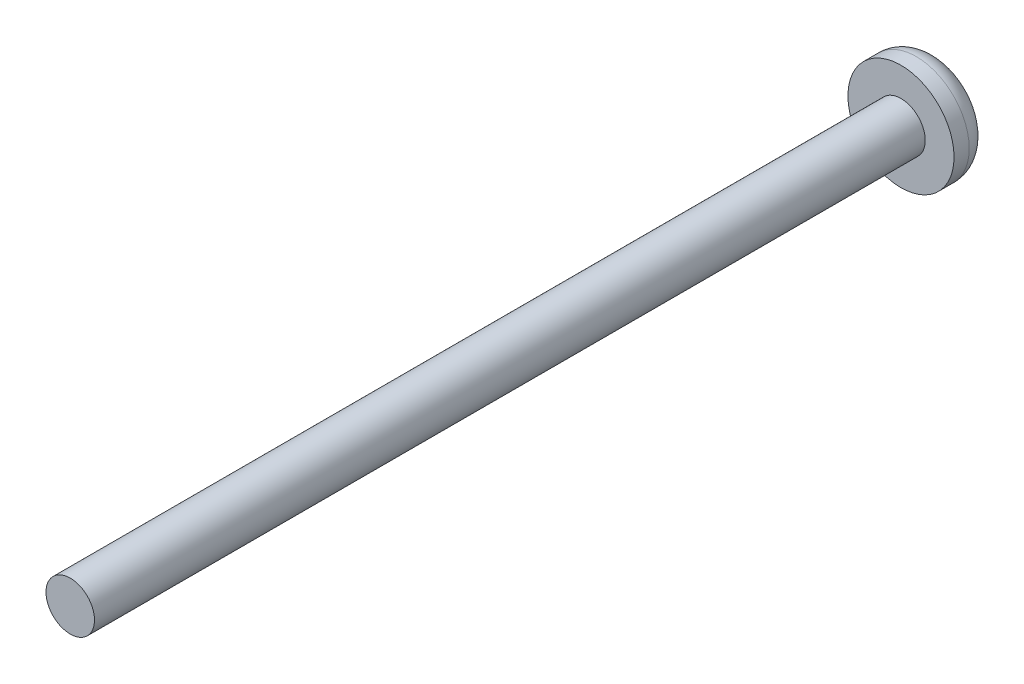
ISO-10303-21;
HEADER;
FILE_DESCRIPTION(('STEP AP214'),'2;1');
FILE_NAME('part.step','',(''),(''),'','','');
FILE_SCHEMA(('AUTOMOTIVE_DESIGN { 1 0 10303 214 1 1 1 1 }'));
ENDSEC;
DATA;
#1=APPLICATION_CONTEXT('core data for automotive mechanical design processes');
#2=APPLICATION_PROTOCOL_DEFINITION('international standard','automotive_design',2000,#1);
#3=PRODUCT_CONTEXT('',#1,'mechanical');
#4=PRODUCT('Part','Part','',(#3));
#5=PRODUCT_RELATED_PRODUCT_CATEGORY('part','',(#4));
#6=PRODUCT_DEFINITION_FORMATION('','',#4);
#7=PRODUCT_DEFINITION_CONTEXT('part definition',#1,'design');
#8=PRODUCT_DEFINITION('design','',#6,#7);
#9=PRODUCT_DEFINITION_SHAPE('','',#8);
#10=(LENGTH_UNIT() NAMED_UNIT(*) SI_UNIT(.MILLI.,.METRE.));
#11=(NAMED_UNIT(*) PLANE_ANGLE_UNIT() SI_UNIT($,.RADIAN.));
#12=(NAMED_UNIT(*) SI_UNIT($,.STERADIAN.) SOLID_ANGLE_UNIT());
#13=UNCERTAINTY_MEASURE_WITH_UNIT(LENGTH_MEASURE(1.E-05),#10,'distance_accuracy_value','');
#14=(GEOMETRIC_REPRESENTATION_CONTEXT(3) GLOBAL_UNCERTAINTY_ASSIGNED_CONTEXT((#13)) GLOBAL_UNIT_ASSIGNED_CONTEXT((#10,
#11,#12)) REPRESENTATION_CONTEXT('',''));
#15=CARTESIAN_POINT('',(0.,0.,0.));
#16=DIRECTION('',(0.,0.,1.));
#17=DIRECTION('',(1.,0.,0.));
#18=AXIS2_PLACEMENT_3D('',#15,#16,#17);
#19=CARTESIAN_POINT('',(0.,0.,0.));
#20=DIRECTION('',(0.,0.,1.));
#21=DIRECTION('',(1.,0.,0.));
#22=AXIS2_PLACEMENT_3D('',#19,#20,#21);
#23=PLANE('',#22);
#24=DIRECTION('',(0.,1.,0.));
#25=VECTOR('',#24,1.);
#26=CARTESIAN_POINT('',(-0.115,1.2,0.));
#27=LINE('',#26,#25);
#28=CARTESIAN_POINT('',(-0.115,-1.04368338110751,0.));
#29=VERTEX_POINT('',#28);
#30=CARTESIAN_POINT('',(-0.115000000000001,-0.115,0.));
#31=VERTEX_POINT('',#30);
#32=EDGE_CURVE('E150',#29,#31,#27,.T.);
#33=ORIENTED_EDGE('',*,*,#32,.F.);
#34=CARTESIAN_POINT('',(0.,0.,0.));
#35=DIRECTION('',(0.,0.,1.));
#36=DIRECTION('',(1.,0.,0.));
#37=AXIS2_PLACEMENT_3D('',#34,#35,#36);
#38=CIRCLE('',#37,1.05);
#39=CARTESIAN_POINT('',(-1.04368338110751,-0.114999999999996,0.));
#40=VERTEX_POINT('',#39);
#41=EDGE_CURVE('E283',#29,#40,#38,.F.);
#42=ORIENTED_EDGE('',*,*,#41,.T.);
#43=DIRECTION('',(-1.,0.,0.));
#44=VECTOR('',#43,1.);
#45=CARTESIAN_POINT('',(1.2,-0.115000000000004,0.));
#46=LINE('',#45,#44);
#47=EDGE_CURVE('E172',#31,#40,#46,.T.);
#48=ORIENTED_EDGE('',*,*,#47,.F.);
#49=EDGE_LOOP('',(#33,#42,#48));
#50=FACE_BOUND('',#49,.T.);
#51=ADVANCED_FACE('F37',(#50),#23,.F.);
#52=DIRECTION('',(1.,0.,0.));
#53=VECTOR('',#52,1.);
#54=CARTESIAN_POINT('',(1.2,0.114999999999996,0.));
#55=LINE('',#54,#53);
#56=CARTESIAN_POINT('',(-1.04368338110751,0.115000000000004,0.));
#57=VERTEX_POINT('',#56);
#58=CARTESIAN_POINT('',(-0.114999999999999,0.115000000000001,0.));
#59=VERTEX_POINT('',#58);
#60=EDGE_CURVE('E122',#57,#59,#55,.T.);
#61=ORIENTED_EDGE('',*,*,#60,.F.);
#62=CARTESIAN_POINT('',(0.,0.,0.));
#63=DIRECTION('',(0.,0.,1.));
#64=DIRECTION('',(1.,0.,0.));
#65=AXIS2_PLACEMENT_3D('',#62,#63,#64);
#66=CIRCLE('',#65,1.05);
#67=CARTESIAN_POINT('',(-0.115,1.04368338110751,0.));
#68=VERTEX_POINT('',#67);
#69=EDGE_CURVE('E149',#57,#68,#66,.F.);
#70=ORIENTED_EDGE('',*,*,#69,.T.);
#71=EDGE_CURVE('E140',#59,#68,#27,.T.);
#72=ORIENTED_EDGE('',*,*,#71,.F.);
#73=EDGE_LOOP('',(#61,#70,#72));
#74=FACE_BOUND('',#73,.T.);
#75=ADVANCED_FACE('F148',(#74),#23,.F.);
#76=DIRECTION('',(0.,-1.,0.));
#77=VECTOR('',#76,1.);
#78=CARTESIAN_POINT('',(0.115,1.2,0.));
#79=LINE('',#78,#77);
#80=CARTESIAN_POINT('',(0.115,1.04368338110751,0.));
#81=VERTEX_POINT('',#80);
#82=CARTESIAN_POINT('',(0.115000000000001,0.114999999999999,0.));
#83=VERTEX_POINT('',#82);
#84=EDGE_CURVE('E267',#81,#83,#79,.T.);
#85=ORIENTED_EDGE('',*,*,#84,.F.);
#86=CARTESIAN_POINT('',(0.,0.,0.));
#87=DIRECTION('',(0.,0.,1.));
#88=DIRECTION('',(1.,0.,0.));
#89=AXIS2_PLACEMENT_3D('',#86,#87,#88);
#90=CIRCLE('',#89,1.05);
#91=CARTESIAN_POINT('',(1.04368338110751,0.114999999999996,0.));
#92=VERTEX_POINT('',#91);
#93=EDGE_CURVE('E274',#81,#92,#90,.F.);
#94=ORIENTED_EDGE('',*,*,#93,.T.);
#95=EDGE_CURVE('E134',#83,#92,#55,.T.);
#96=ORIENTED_EDGE('',*,*,#95,.F.);
#97=EDGE_LOOP('',(#85,#94,#96));
#98=FACE_BOUND('',#97,.T.);
#99=ADVANCED_FACE('F357',(#98),#23,.F.);
#100=CARTESIAN_POINT('',(1.04368338110751,-0.115000000000004,0.));
#101=VERTEX_POINT('',#100);
#102=CARTESIAN_POINT('',(0.115,-0.115000000000001,0.));
#103=VERTEX_POINT('',#102);
#104=EDGE_CURVE('E168',#101,#103,#46,.T.);
#105=ORIENTED_EDGE('',*,*,#104,.F.);
#106=CARTESIAN_POINT('',(0.,0.,0.));
#107=DIRECTION('',(0.,0.,1.));
#108=DIRECTION('',(1.,0.,0.));
#109=AXIS2_PLACEMENT_3D('',#106,#107,#108);
#110=CIRCLE('',#109,1.05);
#111=CARTESIAN_POINT('',(0.115,-1.04368338110751,0.));
#112=VERTEX_POINT('',#111);
#113=EDGE_CURVE('E173',#101,#112,#110,.F.);
#114=ORIENTED_EDGE('',*,*,#113,.T.);
#115=EDGE_CURVE('E152',#103,#112,#79,.T.);
#116=ORIENTED_EDGE('',*,*,#115,.F.);
#117=EDGE_LOOP('',(#105,#114,#116));
#118=FACE_BOUND('',#117,.T.);
#119=ADVANCED_FACE('F211',(#118),#23,.F.);
#120=CARTESIAN_POINT('',(0.,0.,0.85));
#121=DIRECTION('',(0.99097150999577,0.,-0.134072616058251));
#122=DIRECTION('',(-0.134072616058251,0.,-0.99097150999577));
#123=AXIS2_PLACEMENT_3D('',#120,#121,#122);
#124=PLANE('',#123);
#125=ORIENTED_EDGE('',*,*,#71,.T.);
#126=CARTESIAN_POINT('',(-0.115,1.04368338110751,0.));
#127=CARTESIAN_POINT('',(-0.114999092186857,1.06679861289495,6.70992323262271E-06));
#128=CARTESIAN_POINT('',(-0.114847239925205,1.08980277795871,0.00112909620500348));
#129=CARTESIAN_POINT('',(-0.11424164538421,1.13558905936816,0.00560522976888136));
#130=CARTESIAN_POINT('',(-0.113787901987548,1.15837117489172,0.00895898530942936));
#131=CARTESIAN_POINT('',(-0.113183213025059,1.18104222286946,0.0134284254669566));
#132=B_SPLINE_CURVE_WITH_KNOTS('',3,(#126,#127,#128,#129,#130,#131),.UNSPECIFIED.,.F.,.F.,(4,2,
4),(0.,0.0690960909400833,0.138192437610661),.UNSPECIFIED.);
#133=CARTESIAN_POINT('',(-0.11318321302499,1.18104222286946,0.0134284254674646));
#134=VERTEX_POINT('',#133);
#135=EDGE_CURVE('E200',#68,#134,#132,.T.);
#136=ORIENTED_EDGE('',*,*,#135,.T.);
#137=DIRECTION('',(0.0779643099473924,-0.813540625538009,0.576257943089423));
#138=VECTOR('',#137,1.);
#139=CARTESIAN_POINT('',(-0.115,1.2,0.));
#140=LINE('',#139,#138);
#141=CARTESIAN_POINT('',(0.,0.,0.85));
#142=VERTEX_POINT('',#141);
#143=EDGE_CURVE('E143',#134,#142,#140,.T.);
#144=ORIENTED_EDGE('',*,*,#143,.T.);
#145=DIRECTION('',(-0.132883613022023,0.132883613022025,-0.982183226684526));
#146=VECTOR('',#145,1.);
#147=CARTESIAN_POINT('',(0.,0.,0.850000000000001));
#148=LINE('',#147,#146);
#149=EDGE_CURVE('E126',#142,#59,#148,.T.);
#150=ORIENTED_EDGE('',*,*,#149,.T.);
#151=EDGE_LOOP('',(#125,#136,#144,#150));
#152=FACE_BOUND('',#151,.T.);
#153=ADVANCED_FACE('F139',(#152),#124,.T.);
#154=DIRECTION('',(0.0779643099473926,0.813540625538009,0.576257943089423));
#155=VECTOR('',#154,1.);
#156=CARTESIAN_POINT('',(-0.115,-1.2,0.));
#157=LINE('',#156,#155);
#158=CARTESIAN_POINT('',(-0.11318321302499,-1.18104222286946,0.0134284254674649));
#159=VERTEX_POINT('',#158);
#160=EDGE_CURVE('E154',#159,#142,#157,.T.);
#161=ORIENTED_EDGE('',*,*,#160,.F.);
#162=CARTESIAN_POINT('',(-0.11318321302499,-1.18104222286946,0.0134284254674649));
#163=CARTESIAN_POINT('',(-0.113787901987513,-1.15837117489174,0.00895898530968507));
#164=CARTESIAN_POINT('',(-0.114241645384198,-1.13558905936819,0.00560522976896842));
#165=CARTESIAN_POINT('',(-0.114847239925217,-1.08980277795874,0.00112909620492191));
#166=CARTESIAN_POINT('',(-0.114999092186868,-1.06679861289497,6.70992315026746E-06));
#167=CARTESIAN_POINT('',(-0.115,-1.04368338110751,0.));
#168=B_SPLINE_CURVE_WITH_KNOTS('',3,(#162,#163,#164,#165,#166,#167),.UNSPECIFIED.,.F.,.F.,(4,2,
4),(0.,0.0690963466706272,0.138192437610735),.UNSPECIFIED.);
#169=EDGE_CURVE('E12',#159,#29,#168,.T.);
#170=ORIENTED_EDGE('',*,*,#169,.T.);
#171=ORIENTED_EDGE('',*,*,#32,.T.);
#172=DIRECTION('',(0.132883613022025,0.132883613022023,0.982183226684526));
#173=VECTOR('',#172,1.);
#174=CARTESIAN_POINT('',(0.,0.,0.850000000000001));
#175=LINE('',#174,#173);
#176=EDGE_CURVE('E145',#31,#142,#175,.T.);
#177=ORIENTED_EDGE('',*,*,#176,.T.);
#178=EDGE_LOOP('',(#161,#170,#171,#177));
#179=FACE_BOUND('',#178,.T.);
#180=ADVANCED_FACE('F210',(#179),#124,.T.);
#181=CARTESIAN_POINT('',(0.,0.,0.850000000000001));
#182=DIRECTION('',(-0.99097150999577,0.,-0.134072616058251));
#183=DIRECTION('',(-0.134072616058251,0.,0.99097150999577));
#184=AXIS2_PLACEMENT_3D('',#181,#182,#183);
#185=PLANE('',#184);
#186=DIRECTION('',(-0.0779643099473926,-0.813540625538009,0.576257943089423));
#187=VECTOR('',#186,1.);
#188=CARTESIAN_POINT('',(0.115,1.2,0.));
#189=LINE('',#188,#187);
#190=CARTESIAN_POINT('',(0.11318321302499,1.18104222286946,0.013428425467465));
#191=VERTEX_POINT('',#190);
#192=EDGE_CURVE('E133',#191,#142,#189,.T.);
#193=ORIENTED_EDGE('',*,*,#192,.F.);
#194=CARTESIAN_POINT('',(0.11318321302499,1.18104222286946,0.0134284254674651));
#195=CARTESIAN_POINT('',(0.113787901987513,1.15837117489174,0.00895898530968519));
#196=CARTESIAN_POINT('',(0.114241645384199,1.13558905936819,0.00560522976896847));
#197=CARTESIAN_POINT('',(0.114847239925217,1.08980277795874,0.00112909620492192));
#198=CARTESIAN_POINT('',(0.114999092186868,1.06679861289497,6.70992315028015E-06));
#199=CARTESIAN_POINT('',(0.115,1.04368338110751,0.));
#200=B_SPLINE_CURVE_WITH_KNOTS('',3,(#194,#195,#196,#197,#198,#199),.UNSPECIFIED.,.F.,.F.,(4,2,
4),(0.,0.0690963466706277,0.138192437610736),.UNSPECIFIED.);
#201=EDGE_CURVE('E230',#191,#81,#200,.T.);
#202=ORIENTED_EDGE('',*,*,#201,.T.);
#203=ORIENTED_EDGE('',*,*,#84,.T.);
#204=DIRECTION('',(-0.132883613022025,-0.132883613022023,0.982183226684526));
#205=VECTOR('',#204,1.);
#206=CARTESIAN_POINT('',(0.,0.,0.85));
#207=LINE('',#206,#205);
#208=EDGE_CURVE('E347',#83,#142,#207,.T.);
#209=ORIENTED_EDGE('',*,*,#208,.T.);
#210=EDGE_LOOP('',(#193,#202,#203,#209));
#211=FACE_BOUND('',#210,.T.);
#212=ADVANCED_FACE('F237',(#211),#185,.T.);
#213=ORIENTED_EDGE('',*,*,#115,.T.);
#214=CARTESIAN_POINT('',(0.115,-1.04368338110751,0.));
#215=CARTESIAN_POINT('',(0.114999092186857,-1.06679861289495,6.70992323259867E-06));
#216=CARTESIAN_POINT('',(0.114847239925205,-1.08980277795871,0.00112909620500342));
#217=CARTESIAN_POINT('',(0.11424164538421,-1.13558905936816,0.00560522976888121));
#218=CARTESIAN_POINT('',(0.113787901987548,-1.15837117489172,0.00895898530942917));
#219=CARTESIAN_POINT('',(0.113183213025059,-1.18104222286946,0.0134284254669564));
#220=B_SPLINE_CURVE_WITH_KNOTS('',3,(#214,#215,#216,#217,#218,#219),.UNSPECIFIED.,.F.,.F.,(4,2,
4),(0.,0.0690960909400826,0.13819243761066),.UNSPECIFIED.);
#221=CARTESIAN_POINT('',(0.11318321302499,-1.18104222286946,0.0134284254674649));
#222=VERTEX_POINT('',#221);
#223=EDGE_CURVE('E64',#112,#222,#220,.T.);
#224=ORIENTED_EDGE('',*,*,#223,.T.);
#225=DIRECTION('',(-0.0779643099473924,0.813540625538009,0.576257943089423));
#226=VECTOR('',#225,1.);
#227=CARTESIAN_POINT('',(0.115,-1.2,0.));
#228=LINE('',#227,#226);
#229=EDGE_CURVE('E252',#222,#142,#228,.T.);
#230=ORIENTED_EDGE('',*,*,#229,.T.);
#231=DIRECTION('',(0.132883613022023,-0.132883613022025,-0.982183226684526));
#232=VECTOR('',#231,1.);
#233=CARTESIAN_POINT('',(0.,0.,0.85));
#234=LINE('',#233,#232);
#235=EDGE_CURVE('E146',#142,#103,#234,.T.);
#236=ORIENTED_EDGE('',*,*,#235,.T.);
#237=EDGE_LOOP('',(#213,#224,#230,#236));
#238=FACE_BOUND('',#237,.T.);
#239=ADVANCED_FACE('F241',(#238),#185,.T.);
#240=CARTESIAN_POINT('',(0.,0.,1.2));
#241=DIRECTION('',(0.,0.,1.));
#242=DIRECTION('',(1.,0.,0.));
#243=AXIS2_PLACEMENT_3D('',#240,#241,#242);
#244=PLANE('',#243);
#245=CARTESIAN_POINT('',(0.,0.,1.2));
#246=DIRECTION('',(0.,0.,1.));
#247=DIRECTION('',(1.,0.,0.));
#248=AXIS2_PLACEMENT_3D('',#245,#246,#247);
#249=CIRCLE('',#248,1.75);
#250=CARTESIAN_POINT('',(1.75,0.,1.2));
#251=VERTEX_POINT('',#250);
#252=EDGE_CURVE('E264',#251,#251,#249,.T.);
#253=ORIENTED_EDGE('',*,*,#252,.T.);
#254=EDGE_LOOP('',(#253));
#255=FACE_BOUND('',#254,.T.);
#256=CARTESIAN_POINT('',(0.,0.,1.2));
#257=DIRECTION('',(0.,0.,1.));
#258=DIRECTION('',(1.,0.,0.));
#259=AXIS2_PLACEMENT_3D('',#256,#257,#258);
#260=CIRCLE('',#259,0.8);
#261=CARTESIAN_POINT('',(-0.8,0.,1.2));
#262=VERTEX_POINT('',#261);
#263=EDGE_CURVE('E265',#262,#262,#260,.T.);
#264=ORIENTED_EDGE('',*,*,#263,.F.);
#265=EDGE_LOOP('',(#264));
#266=FACE_BOUND('',#265,.T.);
#267=ADVANCED_FACE('F416',(#255,#266),#244,.T.);
#268=CARTESIAN_POINT('',(0.,0.,1.2));
#269=DIRECTION('',(0.,0.,-1.));
#270=DIRECTION('',(-1.,0.,0.));
#271=AXIS2_PLACEMENT_3D('',#268,#269,#270);
#272=CYLINDRICAL_SURFACE('',#271,1.75);
#273=CARTESIAN_POINT('',(0.,0.,0.7));
#274=DIRECTION('',(0.,0.,1.));
#275=DIRECTION('',(1.,0.,0.));
#276=AXIS2_PLACEMENT_3D('',#273,#274,#275);
#277=CIRCLE('',#276,1.75);
#278=CARTESIAN_POINT('',(1.75,0.,0.7));
#279=VERTEX_POINT('',#278);
#280=EDGE_CURVE('E160',#279,#279,#277,.T.);
#281=ORIENTED_EDGE('',*,*,#280,.T.);
#282=EDGE_LOOP('',(#281));
#283=FACE_BOUND('',#282,.T.);
#284=ORIENTED_EDGE('',*,*,#252,.F.);
#285=EDGE_LOOP('',(#284));
#286=FACE_BOUND('',#285,.T.);
#287=ADVANCED_FACE('F422',(#283,#286),#272,.T.);
#288=CARTESIAN_POINT('',(0.,0.,28.6));
#289=DIRECTION('',(0.,0.,-1.));
#290=DIRECTION('',(-1.,0.,0.));
#291=AXIS2_PLACEMENT_3D('',#288,#289,#290);
#292=CYLINDRICAL_SURFACE('',#291,0.8);
#293=CARTESIAN_POINT('',(0.,0.,28.6));
#294=DIRECTION('',(0.,0.,1.));
#295=DIRECTION('',(1.,0.,0.));
#296=AXIS2_PLACEMENT_3D('',#293,#294,#295);
#297=CIRCLE('',#296,0.8);
#298=CARTESIAN_POINT('',(-0.8,0.,28.6));
#299=VERTEX_POINT('',#298);
#300=EDGE_CURVE('E261',#299,#299,#297,.T.);
#301=CARTESIAN_POINT('',(-0.8,0.,28.6));
#302=CARTESIAN_POINT('',(-0.8,0.,28.3145833333333));
#303=CARTESIAN_POINT('',(-0.8,0.,28.0291666666667));
#304=CARTESIAN_POINT('',(-0.8,0.,27.4583333333333));
#305=CARTESIAN_POINT('',(-0.8,0.,27.1729166666667));
#306=CARTESIAN_POINT('',(-0.8,0.,26.6020833333333));
#307=CARTESIAN_POINT('',(-0.8,0.,26.3166666666667));
#308=CARTESIAN_POINT('',(-0.8,0.,25.7458333333333));
#309=CARTESIAN_POINT('',(-0.8,0.,25.4604166666667));
#310=CARTESIAN_POINT('',(-0.8,0.,24.8895833333333));
#311=CARTESIAN_POINT('',(-0.8,0.,24.6041666666667));
#312=CARTESIAN_POINT('',(-0.8,0.,24.0333333333333));
#313=CARTESIAN_POINT('',(-0.8,0.,23.7479166666667));
#314=CARTESIAN_POINT('',(-0.8,0.,23.1770833333333));
#315=CARTESIAN_POINT('',(-0.8,0.,22.8916666666667));
#316=CARTESIAN_POINT('',(-0.8,0.,22.3208333333333));
#317=CARTESIAN_POINT('',(-0.8,0.,22.0354166666667));
#318=CARTESIAN_POINT('',(-0.8,0.,21.4645833333333));
#319=CARTESIAN_POINT('',(-0.8,0.,21.1791666666667));
#320=CARTESIAN_POINT('',(-0.8,0.,20.6083333333333));
#321=CARTESIAN_POINT('',(-0.8,0.,20.3229166666667));
#322=CARTESIAN_POINT('',(-0.8,0.,19.7520833333333));
#323=CARTESIAN_POINT('',(-0.8,0.,19.4666666666667));
#324=CARTESIAN_POINT('',(-0.8,0.,18.8958333333333));
#325=CARTESIAN_POINT('',(-0.8,0.,18.6104166666667));
#326=CARTESIAN_POINT('',(-0.8,0.,18.0395833333333));
#327=CARTESIAN_POINT('',(-0.8,0.,17.7541666666667));
#328=CARTESIAN_POINT('',(-0.8,0.,17.1833333333333));
#329=CARTESIAN_POINT('',(-0.8,0.,16.8979166666667));
#330=CARTESIAN_POINT('',(-0.8,0.,16.3270833333333));
#331=CARTESIAN_POINT('',(-0.8,0.,16.0416666666667));
#332=CARTESIAN_POINT('',(-0.8,0.,15.4708333333333));
#333=CARTESIAN_POINT('',(-0.8,0.,15.1854166666667));
#334=CARTESIAN_POINT('',(-0.8,0.,14.6145833333333));
#335=CARTESIAN_POINT('',(-0.8,0.,14.3291666666667));
#336=CARTESIAN_POINT('',(-0.8,0.,13.7583333333333));
#337=CARTESIAN_POINT('',(-0.8,0.,13.4729166666667));
#338=CARTESIAN_POINT('',(-0.8,0.,12.9020833333333));
#339=CARTESIAN_POINT('',(-0.8,0.,12.6166666666667));
#340=CARTESIAN_POINT('',(-0.8,0.,12.0458333333333));
#341=CARTESIAN_POINT('',(-0.8,0.,11.7604166666667));
#342=CARTESIAN_POINT('',(-0.8,0.,11.1895833333333));
#343=CARTESIAN_POINT('',(-0.8,0.,10.9041666666667));
#344=CARTESIAN_POINT('',(-0.8,0.,10.3333333333333));
#345=CARTESIAN_POINT('',(-0.8,0.,10.0479166666667));
#346=CARTESIAN_POINT('',(-0.8,0.,9.47708333333333));
#347=CARTESIAN_POINT('',(-0.8,0.,9.19166666666667));
#348=CARTESIAN_POINT('',(-0.8,0.,8.62083333333333));
#349=CARTESIAN_POINT('',(-0.8,0.,8.33541666666667));
#350=CARTESIAN_POINT('',(-0.8,0.,7.76458333333333));
#351=CARTESIAN_POINT('',(-0.8,0.,7.47916666666667));
#352=CARTESIAN_POINT('',(-0.8,0.,6.90833333333333));
#353=CARTESIAN_POINT('',(-0.8,0.,6.62291666666667));
#354=CARTESIAN_POINT('',(-0.8,0.,6.05208333333333));
#355=CARTESIAN_POINT('',(-0.8,0.,5.76666666666667));
#356=CARTESIAN_POINT('',(-0.8,0.,5.19583333333333));
#357=CARTESIAN_POINT('',(-0.8,0.,4.91041666666667));
#358=CARTESIAN_POINT('',(-0.8,0.,4.33958333333333));
#359=CARTESIAN_POINT('',(-0.8,0.,4.05416666666667));
#360=CARTESIAN_POINT('',(-0.8,0.,3.48333333333333));
#361=CARTESIAN_POINT('',(-0.8,0.,3.19791666666666));
#362=CARTESIAN_POINT('',(-0.8,0.,2.62708333333333));
#363=CARTESIAN_POINT('',(-0.8,0.,2.34166666666667));
#364=CARTESIAN_POINT('',(-0.8,0.,1.77083333333333));
#365=CARTESIAN_POINT('',(-0.8,0.,1.48541666666667));
#366=CARTESIAN_POINT('',(-0.8,0.,1.2));
#367=B_SPLINE_CURVE_WITH_KNOTS('',3,(#301,#302,#303,#304,#305,#306,#307,#308,#309,#310,#311,
#312,#313,#314,#315,#316,#317,#318,#319,#320,#321,#322,#323,#324,#325,#326,#327,#328,#329,#330,
#331,#332,#333,#334,#335,#336,#337,#338,#339,#340,#341,#342,#343,#344,#345,#346,#347,#348,#349,
#350,#351,#352,#353,#354,#355,#356,#357,#358,#359,#360,#361,#362,#363,#364,#365,#366),
.UNSPECIFIED.,.F.,.F.,(4,2,2,2,2,2,2,2,2,2,2,2,2,2,2,2,2,2,2,2,2,2,2,2,2,2,2,2,2,2,2,2,4),(0.,
0.856249999999999,1.7125,2.56875,3.425,4.28125,5.1375,5.99375,6.85,7.70625,8.56249999999999,
9.41875,10.275,11.13125,11.9875,12.84375,13.7,14.55625,15.4125,16.26875,17.125,17.98125,18.8375,
19.69375,20.55,21.40625,22.2625,23.11875,23.975,24.83125,25.6875,26.54375,27.4),.UNSPECIFIED.);
#368=EDGE_CURVE('BSEAM427',#299,#262,#367,.T.);
#369=ORIENTED_EDGE('',*,*,#300,.F.);
#370=ORIENTED_EDGE('',*,*,#263,.T.);
#371=ORIENTED_EDGE('',*,*,#368,.T.);
#372=ORIENTED_EDGE('',*,*,#368,.F.);
#373=EDGE_LOOP('',(#369,#371,#370,#372));
#374=FACE_BOUND('',#373,.T.);
#375=ADVANCED_FACE('F427',(#374),#292,.T.);
#376=CARTESIAN_POINT('',(0.,0.,28.6));
#377=DIRECTION('',(0.,0.,1.));
#378=DIRECTION('',(1.,0.,0.));
#379=AXIS2_PLACEMENT_3D('',#376,#377,#378);
#380=PLANE('',#379);
#381=ORIENTED_EDGE('',*,*,#300,.T.);
#382=EDGE_LOOP('',(#381));
#383=FACE_BOUND('',#382,.T.);
#384=ADVANCED_FACE('F221',(#383),#380,.T.);
#385=CARTESIAN_POINT('',(-0.115,1.2,0.));
#386=DIRECTION('',(0.,0.578017340780339,0.816024481101655));
#387=DIRECTION('',(0.,-0.816024481101655,0.578017340780339));
#388=AXIS2_PLACEMENT_3D('',#385,#386,#387);
#389=PLANE('',#388);
#390=ORIENTED_EDGE('',*,*,#143,.F.);
#391=CARTESIAN_POINT('',(-0.11318321302499,1.18104222286946,0.0134284254674647));
#392=CARTESIAN_POINT('',(-0.0754554753499932,1.18182261156929,0.0128756501384193));
#393=CARTESIAN_POINT('',(-0.0377277376749966,1.1822128059192,0.0125992624738967));
#394=CARTESIAN_POINT('',(0.0377277376749968,1.1822128059192,0.0125992624738968));
#395=CARTESIAN_POINT('',(0.0754554753499935,1.18182261156929,0.0128756501384195));
#396=CARTESIAN_POINT('',(0.11318321302499,1.18104222286946,0.013428425467465));
#397=B_SPLINE_CURVE_WITH_KNOTS('',3,(#391,#392,#393,#394,#395,#396),.UNSPECIFIED.,.F.,.F.,(4,2,
4),(0.,0.113192303124402,0.226384606248804),.UNSPECIFIED.);
#398=EDGE_CURVE('E205',#134,#191,#397,.T.);
#399=ORIENTED_EDGE('',*,*,#398,.T.);
#400=ORIENTED_EDGE('',*,*,#192,.T.);
#401=EDGE_LOOP('',(#390,#399,#400));
#402=FACE_BOUND('',#401,.T.);
#403=ADVANCED_FACE('F215',(#402),#389,.F.);
#404=CARTESIAN_POINT('',(0.115,-1.2,0.));
#405=DIRECTION('',(0.,-0.578017340780339,0.816024481101655));
#406=DIRECTION('',(0.,-0.816024481101655,-0.578017340780339));
#407=AXIS2_PLACEMENT_3D('',#404,#405,#406);
#408=PLANE('',#407);
#409=ORIENTED_EDGE('',*,*,#229,.F.);
#410=CARTESIAN_POINT('',(0.11318321302499,-1.18104222286946,0.0134284254674649));
#411=CARTESIAN_POINT('',(0.0754554753499932,-1.18182261156929,0.0128756501384193));
#412=CARTESIAN_POINT('',(0.0377277376749965,-1.1822128059192,0.0125992624738966));
#413=CARTESIAN_POINT('',(-0.0377277376749968,-1.1822128059192,0.0125992624738966));
#414=CARTESIAN_POINT('',(-0.0754554753499935,-1.18182261156929,0.0128756501384194));
#415=CARTESIAN_POINT('',(-0.11318321302499,-1.18104222286946,0.013428425467465));
#416=B_SPLINE_CURVE_WITH_KNOTS('',3,(#410,#411,#412,#413,#414,#415),.UNSPECIFIED.,.F.,.F.,(4,2,
4),(0.,0.113192303124402,0.226384606248804),.UNSPECIFIED.);
#417=EDGE_CURVE('E50',#222,#159,#416,.T.);
#418=ORIENTED_EDGE('',*,*,#417,.T.);
#419=ORIENTED_EDGE('',*,*,#160,.T.);
#420=EDGE_LOOP('',(#409,#418,#419));
#421=FACE_BOUND('',#420,.T.);
#422=ADVANCED_FACE('F220',(#421),#408,.F.);
#423=CARTESIAN_POINT('',(0.,0.,0.850000000000001));
#424=DIRECTION('',(0.,0.99097150999577,-0.134072616058251));
#425=DIRECTION('',(0.,0.134072616058251,0.99097150999577));
#426=AXIS2_PLACEMENT_3D('',#423,#424,#425);
#427=PLANE('',#426);
#428=DIRECTION('',(-0.813540625538009,0.0779643099473954,0.576257943089423));
#429=VECTOR('',#428,1.);
#430=CARTESIAN_POINT('',(1.2,-0.115000000000004,0.));
#431=LINE('',#430,#429);
#432=CARTESIAN_POINT('',(1.18104222286946,-0.113183213024994,0.0134284254674646));
#433=VERTEX_POINT('',#432);
#434=EDGE_CURVE('E171',#433,#142,#431,.T.);
#435=ORIENTED_EDGE('',*,*,#434,.F.);
#436=CARTESIAN_POINT('',(1.18104222286946,-0.113183213024994,0.0134284254674647));
#437=CARTESIAN_POINT('',(1.15837117489174,-0.113787901987517,0.00895898530968497));
#438=CARTESIAN_POINT('',(1.13558905936819,-0.114241645384203,0.0056052297689684));
#439=CARTESIAN_POINT('',(1.08980277795874,-0.11484723992522,0.001129096204922));
#440=CARTESIAN_POINT('',(1.06679861289497,-0.114999092186872,6.70992315036465E-06));
#441=CARTESIAN_POINT('',(1.04368338110751,-0.115000000000004,0.));
#442=B_SPLINE_CURVE_WITH_KNOTS('',3,(#436,#437,#438,#439,#440,#441),.UNSPECIFIED.,.F.,.F.,(4,2,
4),(0.,0.0690963466706278,0.138192437610736),.UNSPECIFIED.);
#443=EDGE_CURVE('E251',#433,#101,#442,.T.);
#444=ORIENTED_EDGE('',*,*,#443,.T.);
#445=ORIENTED_EDGE('',*,*,#104,.T.);
#446=ORIENTED_EDGE('',*,*,#235,.F.);
#447=EDGE_LOOP('',(#435,#444,#445,#446));
#448=FACE_BOUND('',#447,.T.);
#449=ADVANCED_FACE('F223',(#448),#427,.T.);
#450=CARTESIAN_POINT('',(0.,0.,0.85));
#451=DIRECTION('',(0.,-0.99097150999577,-0.134072616058251));
#452=DIRECTION('',(0.,0.134072616058251,-0.99097150999577));
#453=AXIS2_PLACEMENT_3D('',#450,#451,#452);
#454=PLANE('',#453);
#455=ORIENTED_EDGE('',*,*,#95,.T.);
#456=CARTESIAN_POINT('',(1.04368338110751,0.114999999999996,0.));
#457=CARTESIAN_POINT('',(1.06679861289495,0.114999092186853,6.70992323261789E-06));
#458=CARTESIAN_POINT('',(1.08980277795871,0.114847239925201,0.00112909620500346));
#459=CARTESIAN_POINT('',(1.13558905936816,0.114241645384206,0.00560522976888129));
#460=CARTESIAN_POINT('',(1.15837117489172,0.113787901987544,0.00895898530942927));
#461=CARTESIAN_POINT('',(1.18104222286946,0.113183213025055,0.0134284254669565));
#462=B_SPLINE_CURVE_WITH_KNOTS('',3,(#456,#457,#458,#459,#460,#461),.UNSPECIFIED.,.F.,.F.,(4,2,
4),(0.,0.0690960909400831,0.138192437610661),.UNSPECIFIED.);
#463=CARTESIAN_POINT('',(1.18104222286946,0.113183213024986,0.0134284254674646));
#464=VERTEX_POINT('',#463);
#465=EDGE_CURVE('E235',#92,#464,#462,.T.);
#466=ORIENTED_EDGE('',*,*,#465,.T.);
#467=DIRECTION('',(-0.813540625538009,-0.0779643099473896,0.576257943089423));
#468=VECTOR('',#467,1.);
#469=CARTESIAN_POINT('',(1.2,0.114999999999996,0.));
#470=LINE('',#469,#468);
#471=EDGE_CURVE('E188',#464,#142,#470,.T.);
#472=ORIENTED_EDGE('',*,*,#471,.T.);
#473=ORIENTED_EDGE('',*,*,#208,.F.);
#474=EDGE_LOOP('',(#455,#466,#472,#473));
#475=FACE_BOUND('',#474,.T.);
#476=ADVANCED_FACE('F212',(#475),#454,.T.);
#477=CARTESIAN_POINT('',(1.2,0.114999999999996,0.));
#478=DIRECTION('',(0.578017340780339,0.,0.816024481101655));
#479=DIRECTION('',(-0.816024481101655,0.,0.578017340780339));
#480=AXIS2_PLACEMENT_3D('',#477,#478,#479);
#481=PLANE('',#480);
#482=ORIENTED_EDGE('',*,*,#471,.F.);
#483=CARTESIAN_POINT('',(1.18104222286946,0.113183213024986,0.0134284254674647));
#484=CARTESIAN_POINT('',(1.18182261156929,0.0754554753499891,0.0128756501384193));
#485=CARTESIAN_POINT('',(1.1822128059192,0.0377277376749924,0.0125992624738967));
#486=CARTESIAN_POINT('',(1.1822128059192,-0.037727737675001,0.0125992624738968));
#487=CARTESIAN_POINT('',(1.18182261156929,-0.0754554753499976,0.0128756501384196));
#488=CARTESIAN_POINT('',(1.18104222286946,-0.113183213024994,0.0134284254674651));
#489=B_SPLINE_CURVE_WITH_KNOTS('',3,(#483,#484,#485,#486,#487,#488),.UNSPECIFIED.,.F.,.F.,(4,2,
4),(0.,0.113192303124402,0.226384606248804),.UNSPECIFIED.);
#490=EDGE_CURVE('E318',#464,#433,#489,.T.);
#491=ORIENTED_EDGE('',*,*,#490,.T.);
#492=ORIENTED_EDGE('',*,*,#434,.T.);
#493=EDGE_LOOP('',(#482,#491,#492));
#494=FACE_BOUND('',#493,.T.);
#495=ADVANCED_FACE('F313',(#494),#481,.F.);
#496=DIRECTION('',(0.813540625538009,-0.0779643099473955,0.576257943089423));
#497=VECTOR('',#496,1.);
#498=CARTESIAN_POINT('',(-1.2,0.115000000000004,0.));
#499=LINE('',#498,#497);
#500=CARTESIAN_POINT('',(-1.18104222286946,0.113183213024994,0.0134284254674651));
#501=VERTEX_POINT('',#500);
#502=EDGE_CURVE('E292',#501,#142,#499,.T.);
#503=ORIENTED_EDGE('',*,*,#502,.F.);
#504=CARTESIAN_POINT('',(-1.18104222286946,0.113183213024994,0.0134284254674651));
#505=CARTESIAN_POINT('',(-1.15837117489174,0.113787901987517,0.00895898530968519));
#506=CARTESIAN_POINT('',(-1.13558905936819,0.114241645384202,0.00560522976896848));
#507=CARTESIAN_POINT('',(-1.08980277795874,0.11484723992522,0.00112909620492192));
#508=CARTESIAN_POINT('',(-1.06679861289497,0.114999092186872,6.70992315028959E-06));
#509=CARTESIAN_POINT('',(-1.04368338110751,0.115000000000004,0.));
#510=B_SPLINE_CURVE_WITH_KNOTS('',3,(#504,#505,#506,#507,#508,#509),.UNSPECIFIED.,.F.,.F.,(4,2,
4),(0.,0.0690963466706272,0.138192437610735),.UNSPECIFIED.);
#511=EDGE_CURVE('E129',#501,#57,#510,.T.);
#512=ORIENTED_EDGE('',*,*,#511,.T.);
#513=ORIENTED_EDGE('',*,*,#60,.T.);
#514=ORIENTED_EDGE('',*,*,#149,.F.);
#515=EDGE_LOOP('',(#503,#512,#513,#514));
#516=FACE_BOUND('',#515,.T.);
#517=ADVANCED_FACE('F125',(#516),#454,.T.);
#518=ORIENTED_EDGE('',*,*,#47,.T.);
#519=CARTESIAN_POINT('',(-1.04368338110751,-0.114999999999996,0.));
#520=CARTESIAN_POINT('',(-1.06679861289495,-0.114999092186853,6.70992323259963E-06));
#521=CARTESIAN_POINT('',(-1.08980277795871,-0.114847239925202,0.00112909620500342));
#522=CARTESIAN_POINT('',(-1.13558905936816,-0.114241645384206,0.00560522976888121));
#523=CARTESIAN_POINT('',(-1.15837117489172,-0.113787901987544,0.00895898530942918));
#524=CARTESIAN_POINT('',(-1.18104222286946,-0.113183213025055,0.0134284254669564));
#525=B_SPLINE_CURVE_WITH_KNOTS('',3,(#519,#520,#521,#522,#523,#524),.UNSPECIFIED.,.F.,.F.,(4,2,
4),(0.,0.0690960909400826,0.13819243761066),.UNSPECIFIED.);
#526=CARTESIAN_POINT('',(-1.18104222286946,-0.113183213024986,0.0134284254674649));
#527=VERTEX_POINT('',#526);
#528=EDGE_CURVE('E288',#40,#527,#525,.T.);
#529=ORIENTED_EDGE('',*,*,#528,.T.);
#530=DIRECTION('',(0.813540625538009,0.0779643099473896,0.576257943089423));
#531=VECTOR('',#530,1.);
#532=CARTESIAN_POINT('',(-1.2,-0.114999999999996,0.));
#533=LINE('',#532,#531);
#534=EDGE_CURVE('E289',#527,#142,#533,.T.);
#535=ORIENTED_EDGE('',*,*,#534,.T.);
#536=ORIENTED_EDGE('',*,*,#176,.F.);
#537=EDGE_LOOP('',(#518,#529,#535,#536));
#538=FACE_BOUND('',#537,.T.);
#539=ADVANCED_FACE('F310',(#538),#427,.T.);
#540=CARTESIAN_POINT('',(-1.2,-0.114999999999996,0.));
#541=DIRECTION('',(-0.578017340780339,0.,0.816024481101655));
#542=DIRECTION('',(-0.816024481101655,0.,-0.578017340780339));
#543=AXIS2_PLACEMENT_3D('',#540,#541,#542);
#544=PLANE('',#543);
#545=ORIENTED_EDGE('',*,*,#534,.F.);
#546=CARTESIAN_POINT('',(-1.18104222286946,-0.113183213024986,0.0134284254674649));
#547=CARTESIAN_POINT('',(-1.18182261156929,-0.0754554753499891,0.0128756501384194));
#548=CARTESIAN_POINT('',(-1.1822128059192,-0.0377277376749924,0.0125992624738967));
#549=CARTESIAN_POINT('',(-1.1822128059192,0.0377277376750009,0.0125992624738967));
#550=CARTESIAN_POINT('',(-1.18182261156929,0.0754554753499976,0.0128756501384194));
#551=CARTESIAN_POINT('',(-1.18104222286946,0.113183213024994,0.0134284254674649));
#552=B_SPLINE_CURVE_WITH_KNOTS('',3,(#546,#547,#548,#549,#550,#551),.UNSPECIFIED.,.F.,.F.,(4,2,
4),(0.,0.113192303124402,0.226384606248804),.UNSPECIFIED.);
#553=EDGE_CURVE('E302',#527,#501,#552,.T.);
#554=ORIENTED_EDGE('',*,*,#553,.T.);
#555=ORIENTED_EDGE('',*,*,#502,.T.);
#556=EDGE_LOOP('',(#545,#554,#555));
#557=FACE_BOUND('',#556,.T.);
#558=ADVANCED_FACE('F307',(#557),#544,.F.);
#559=CARTESIAN_POINT('',(0.,0.,0.7));
#560=DIRECTION('',(0.,0.,1.));
#561=DIRECTION('',(1.,0.,0.));
#562=AXIS2_PLACEMENT_3D('',#559,#560,#561);
#563=TOROIDAL_SURFACE('',#562,1.05,0.7);
#564=ORIENTED_EDGE('',*,*,#528,.F.);
#565=ORIENTED_EDGE('',*,*,#41,.F.);
#566=ORIENTED_EDGE('',*,*,#169,.F.);
#567=ORIENTED_EDGE('',*,*,#417,.F.);
#568=ORIENTED_EDGE('',*,*,#223,.F.);
#569=ORIENTED_EDGE('',*,*,#113,.F.);
#570=ORIENTED_EDGE('',*,*,#443,.F.);
#571=ORIENTED_EDGE('',*,*,#490,.F.);
#572=ORIENTED_EDGE('',*,*,#465,.F.);
#573=ORIENTED_EDGE('',*,*,#93,.F.);
#574=ORIENTED_EDGE('',*,*,#201,.F.);
#575=ORIENTED_EDGE('',*,*,#398,.F.);
#576=ORIENTED_EDGE('',*,*,#135,.F.);
#577=ORIENTED_EDGE('',*,*,#69,.F.);
#578=ORIENTED_EDGE('',*,*,#511,.F.);
#579=ORIENTED_EDGE('',*,*,#553,.F.);
#580=EDGE_LOOP('',(#564,#565,#566,#567,#568,#569,#570,#571,#572,#573,#574,#575,#576,#577,#578,#579));
#581=FACE_BOUND('',#580,.T.);
#582=ORIENTED_EDGE('',*,*,#280,.F.);
#583=EDGE_LOOP('',(#582));
#584=FACE_BOUND('',#583,.T.);
#585=ADVANCED_FACE('F39',(#581,#584),#563,.T.);
#586=CLOSED_SHELL('',(#51,#75,#99,#119,#153,#180,#212,#239,#267,#287,#375,#384,#403,#422,#449,
#476,#495,#517,#539,#558,#585));
#587=MANIFOLD_SOLID_BREP('B2',#586);
#588=ADVANCED_BREP_SHAPE_REPRESENTATION('',(#18,#587),#14);
#589=SHAPE_DEFINITION_REPRESENTATION(#9,#588);
ENDSEC;
END-ISO-10303-21;
